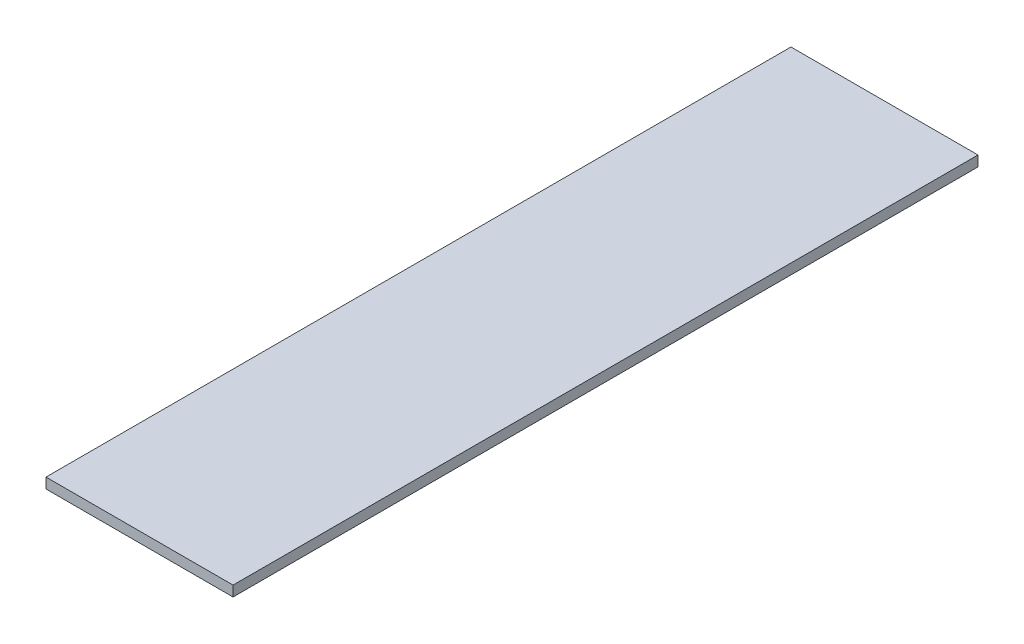
ISO-10303-21;
HEADER;
FILE_DESCRIPTION(('STEP AP214'),'2;1');
FILE_NAME('part.step','',(''),(''),'','','');
FILE_SCHEMA(('AUTOMOTIVE_DESIGN { 1 0 10303 214 1 1 1 1 }'));
ENDSEC;
DATA;
#1=APPLICATION_CONTEXT('core data for automotive mechanical design processes');
#2=APPLICATION_PROTOCOL_DEFINITION('international standard','automotive_design',2000,#1);
#3=PRODUCT_CONTEXT('',#1,'mechanical');
#4=PRODUCT('Part','Part','',(#3));
#5=PRODUCT_RELATED_PRODUCT_CATEGORY('part','',(#4));
#6=PRODUCT_DEFINITION_FORMATION('','',#4);
#7=PRODUCT_DEFINITION_CONTEXT('part definition',#1,'design');
#8=PRODUCT_DEFINITION('design','',#6,#7);
#9=PRODUCT_DEFINITION_SHAPE('','',#8);
#10=(LENGTH_UNIT() NAMED_UNIT(*) SI_UNIT(.MILLI.,.METRE.));
#11=(NAMED_UNIT(*) PLANE_ANGLE_UNIT() SI_UNIT($,.RADIAN.));
#12=(NAMED_UNIT(*) SI_UNIT($,.STERADIAN.) SOLID_ANGLE_UNIT());
#13=UNCERTAINTY_MEASURE_WITH_UNIT(LENGTH_MEASURE(1.E-05),#10,'distance_accuracy_value','');
#14=(GEOMETRIC_REPRESENTATION_CONTEXT(3) GLOBAL_UNCERTAINTY_ASSIGNED_CONTEXT((#13)) GLOBAL_UNIT_ASSIGNED_CONTEXT((#10,
#11,#12)) REPRESENTATION_CONTEXT('',''));
#15=CARTESIAN_POINT('',(0.,0.,0.));
#16=DIRECTION('',(0.,0.,1.));
#17=DIRECTION('',(1.,0.,0.));
#18=AXIS2_PLACEMENT_3D('',#15,#16,#17);
#19=CARTESIAN_POINT('',(0.,3.175,0.));
#20=DIRECTION('',(0.,0.,-1.));
#21=DIRECTION('',(-1.,0.,0.));
#22=AXIS2_PLACEMENT_3D('',#19,#20,#21);
#23=PLANE('',#22);
#24=DIRECTION('',(1.,0.,0.));
#25=VECTOR('',#24,1.);
#26=CARTESIAN_POINT('',(0.,0.,0.));
#27=LINE('',#26,#25);
#28=CARTESIAN_POINT('',(0.,0.,0.));
#29=VERTEX_POINT('',#28);
#30=CARTESIAN_POINT('',(57.404,0.,0.));
#31=VERTEX_POINT('',#30);
#32=EDGE_CURVE('E111',#29,#31,#27,.T.);
#33=ORIENTED_EDGE('',*,*,#32,.T.);
#34=DIRECTION('',(0.,-1.,0.));
#35=VECTOR('',#34,1.);
#36=CARTESIAN_POINT('',(57.404,3.175,0.));
#37=LINE('',#36,#35);
#38=CARTESIAN_POINT('',(57.404,3.175,0.));
#39=VERTEX_POINT('',#38);
#40=EDGE_CURVE('E11',#39,#31,#37,.T.);
#41=ORIENTED_EDGE('',*,*,#40,.F.);
#42=DIRECTION('',(1.,0.,0.));
#43=VECTOR('',#42,1.);
#44=CARTESIAN_POINT('',(0.,3.175,0.));
#45=LINE('',#44,#43);
#46=CARTESIAN_POINT('',(0.,3.175,0.));
#47=VERTEX_POINT('',#46);
#48=EDGE_CURVE('E93',#47,#39,#45,.T.);
#49=ORIENTED_EDGE('',*,*,#48,.F.);
#50=DIRECTION('',(0.,-1.,0.));
#51=VECTOR('',#50,1.);
#52=CARTESIAN_POINT('',(0.,3.175,0.));
#53=LINE('',#52,#51);
#54=EDGE_CURVE('E60',#47,#29,#53,.T.);
#55=ORIENTED_EDGE('',*,*,#54,.T.);
#56=EDGE_LOOP('',(#33,#41,#49,#55));
#57=FACE_BOUND('',#56,.T.);
#58=ADVANCED_FACE('F43',(#57),#23,.F.);
#59=CARTESIAN_POINT('',(57.404,3.175,0.));
#60=DIRECTION('',(-1.,0.,0.));
#61=DIRECTION('',(0.,0.,1.));
#62=AXIS2_PLACEMENT_3D('',#59,#60,#61);
#63=PLANE('',#62);
#64=DIRECTION('',(0.,0.,-1.));
#65=VECTOR('',#64,1.);
#66=CARTESIAN_POINT('',(57.404,0.,0.));
#67=LINE('',#66,#65);
#68=CARTESIAN_POINT('',(57.404,0.,-228.6));
#69=VERTEX_POINT('',#68);
#70=EDGE_CURVE('E99',#31,#69,#67,.T.);
#71=ORIENTED_EDGE('',*,*,#70,.T.);
#72=DIRECTION('',(0.,-1.,0.));
#73=VECTOR('',#72,1.);
#74=CARTESIAN_POINT('',(57.404,3.175,-228.6));
#75=LINE('',#74,#73);
#76=CARTESIAN_POINT('',(57.404,3.175,-228.6));
#77=VERTEX_POINT('',#76);
#78=EDGE_CURVE('E52',#77,#69,#75,.T.);
#79=ORIENTED_EDGE('',*,*,#78,.F.);
#80=DIRECTION('',(0.,0.,-1.));
#81=VECTOR('',#80,1.);
#82=CARTESIAN_POINT('',(57.404,3.175,0.));
#83=LINE('',#82,#81);
#84=EDGE_CURVE('E85',#39,#77,#83,.T.);
#85=ORIENTED_EDGE('',*,*,#84,.F.);
#86=ORIENTED_EDGE('',*,*,#40,.T.);
#87=EDGE_LOOP('',(#71,#79,#85,#86));
#88=FACE_BOUND('',#87,.T.);
#89=ADVANCED_FACE('F98',(#88),#63,.F.);
#90=CARTESIAN_POINT('',(0.,3.175,-228.6));
#91=DIRECTION('',(0.,0.,-1.));
#92=DIRECTION('',(-1.,0.,0.));
#93=AXIS2_PLACEMENT_3D('',#90,#91,#92);
#94=PLANE('',#93);
#95=DIRECTION('',(1.,0.,0.));
#96=VECTOR('',#95,1.);
#97=CARTESIAN_POINT('',(0.,0.,-228.6));
#98=LINE('',#97,#96);
#99=CARTESIAN_POINT('',(0.,0.,-228.6));
#100=VERTEX_POINT('',#99);
#101=EDGE_CURVE('E116',#100,#69,#98,.T.);
#102=ORIENTED_EDGE('',*,*,#101,.F.);
#103=DIRECTION('',(0.,-1.,0.));
#104=VECTOR('',#103,1.);
#105=CARTESIAN_POINT('',(0.,3.175,-228.6));
#106=LINE('',#105,#104);
#107=CARTESIAN_POINT('',(0.,3.175,-228.6));
#108=VERTEX_POINT('',#107);
#109=EDGE_CURVE('E74',#108,#100,#106,.T.);
#110=ORIENTED_EDGE('',*,*,#109,.F.);
#111=DIRECTION('',(1.,0.,0.));
#112=VECTOR('',#111,1.);
#113=CARTESIAN_POINT('',(0.,3.175,-228.6));
#114=LINE('',#113,#112);
#115=EDGE_CURVE('E92',#108,#77,#114,.T.);
#116=ORIENTED_EDGE('',*,*,#115,.T.);
#117=ORIENTED_EDGE('',*,*,#78,.T.);
#118=EDGE_LOOP('',(#102,#110,#116,#117));
#119=FACE_BOUND('',#118,.T.);
#120=ADVANCED_FACE('F103',(#119),#94,.T.);
#121=CARTESIAN_POINT('',(0.,3.175,0.));
#122=DIRECTION('',(-1.,0.,0.));
#123=DIRECTION('',(0.,0.,1.));
#124=AXIS2_PLACEMENT_3D('',#121,#122,#123);
#125=PLANE('',#124);
#126=DIRECTION('',(0.,0.,-1.));
#127=VECTOR('',#126,1.);
#128=CARTESIAN_POINT('',(0.,0.,0.));
#129=LINE('',#128,#127);
#130=EDGE_CURVE('E119',#29,#100,#129,.T.);
#131=ORIENTED_EDGE('',*,*,#130,.F.);
#132=ORIENTED_EDGE('',*,*,#54,.F.);
#133=DIRECTION('',(0.,0.,-1.));
#134=VECTOR('',#133,1.);
#135=CARTESIAN_POINT('',(0.,3.175,0.));
#136=LINE('',#135,#134);
#137=EDGE_CURVE('E105',#47,#108,#136,.T.);
#138=ORIENTED_EDGE('',*,*,#137,.T.);
#139=ORIENTED_EDGE('',*,*,#109,.T.);
#140=EDGE_LOOP('',(#131,#132,#138,#139));
#141=FACE_BOUND('',#140,.T.);
#142=ADVANCED_FACE('F129',(#141),#125,.T.);
#143=CARTESIAN_POINT('',(0.,3.175,0.));
#144=DIRECTION('',(0.,1.,0.));
#145=DIRECTION('',(0.,0.,1.));
#146=AXIS2_PLACEMENT_3D('',#143,#144,#145);
#147=PLANE('',#146);
#148=ORIENTED_EDGE('',*,*,#48,.T.);
#149=ORIENTED_EDGE('',*,*,#84,.T.);
#150=ORIENTED_EDGE('',*,*,#115,.F.);
#151=ORIENTED_EDGE('',*,*,#137,.F.);
#152=EDGE_LOOP('',(#148,#149,#150,#151));
#153=FACE_BOUND('',#152,.T.);
#154=ADVANCED_FACE('F89',(#153),#147,.T.);
#155=CARTESIAN_POINT('',(0.,0.,0.));
#156=DIRECTION('',(0.,1.,0.));
#157=DIRECTION('',(0.,0.,1.));
#158=AXIS2_PLACEMENT_3D('',#155,#156,#157);
#159=PLANE('',#158);
#160=ORIENTED_EDGE('',*,*,#32,.F.);
#161=ORIENTED_EDGE('',*,*,#130,.T.);
#162=ORIENTED_EDGE('',*,*,#101,.T.);
#163=ORIENTED_EDGE('',*,*,#70,.F.);
#164=EDGE_LOOP('',(#160,#161,#162,#163));
#165=FACE_BOUND('',#164,.T.);
#166=ADVANCED_FACE('F128',(#165),#159,.F.);
#167=CLOSED_SHELL('',(#58,#89,#120,#142,#154,#166));
#168=MANIFOLD_SOLID_BREP('B2',#167);
#169=ADVANCED_BREP_SHAPE_REPRESENTATION('',(#18,#168),#14);
#170=SHAPE_DEFINITION_REPRESENTATION(#9,#169);
ENDSEC;
END-ISO-10303-21;
